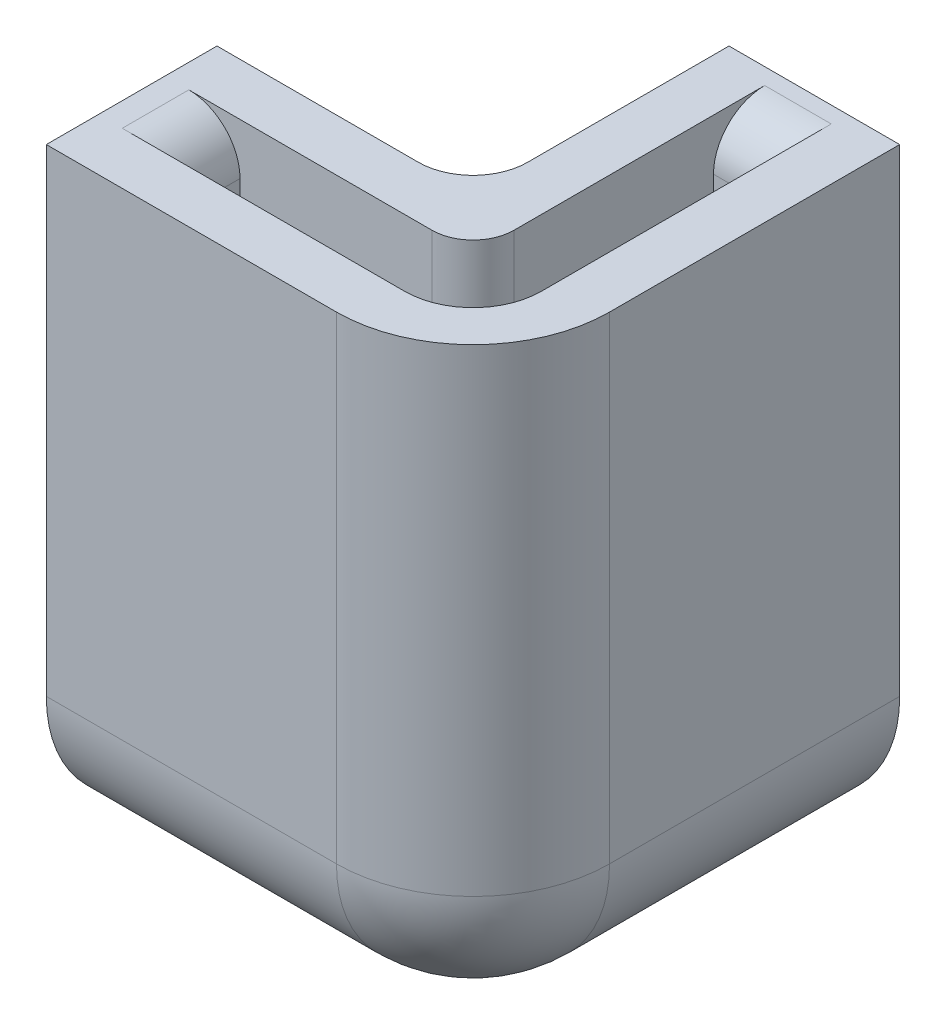
ISO-10303-21;
HEADER;
FILE_DESCRIPTION(('STEP AP214'),'2;1');
FILE_NAME('part.step','',(''),(''),'','','');
FILE_SCHEMA(('AUTOMOTIVE_DESIGN { 1 0 10303 214 1 1 1 1 }'));
ENDSEC;
DATA;
#1=APPLICATION_CONTEXT('core data for automotive mechanical design processes');
#2=APPLICATION_PROTOCOL_DEFINITION('international standard','automotive_design',2000,#1);
#3=PRODUCT_CONTEXT('',#1,'mechanical');
#4=PRODUCT('Part','Part','',(#3));
#5=PRODUCT_RELATED_PRODUCT_CATEGORY('part','',(#4));
#6=PRODUCT_DEFINITION_FORMATION('','',#4);
#7=PRODUCT_DEFINITION_CONTEXT('part definition',#1,'design');
#8=PRODUCT_DEFINITION('design','',#6,#7);
#9=PRODUCT_DEFINITION_SHAPE('','',#8);
#10=(LENGTH_UNIT() NAMED_UNIT(*) SI_UNIT(.MILLI.,.METRE.));
#11=(NAMED_UNIT(*) PLANE_ANGLE_UNIT() SI_UNIT($,.RADIAN.));
#12=(NAMED_UNIT(*) SI_UNIT($,.STERADIAN.) SOLID_ANGLE_UNIT());
#13=UNCERTAINTY_MEASURE_WITH_UNIT(LENGTH_MEASURE(1.E-05),#10,'distance_accuracy_value','');
#14=(GEOMETRIC_REPRESENTATION_CONTEXT(3) GLOBAL_UNCERTAINTY_ASSIGNED_CONTEXT((#13)) GLOBAL_UNIT_ASSIGNED_CONTEXT((#10,
#11,#12)) REPRESENTATION_CONTEXT('',''));
#15=CARTESIAN_POINT('',(0.,0.,0.));
#16=DIRECTION('',(0.,0.,1.));
#17=DIRECTION('',(1.,0.,0.));
#18=AXIS2_PLACEMENT_3D('',#15,#16,#17);
#19=CARTESIAN_POINT('',(7.5,18.,-12.5));
#20=DIRECTION('',(1.,0.,0.));
#21=DIRECTION('',(0.,0.,-1.));
#22=AXIS2_PLACEMENT_3D('',#19,#20,#21);
#23=PLANE('',#22);
#24=DIRECTION('',(0.,-1.,0.));
#25=VECTOR('',#24,1.);
#26=CARTESIAN_POINT('',(7.5,18.,-12.5));
#27=LINE('',#26,#25);
#28=CARTESIAN_POINT('',(7.5,18.,-12.5));
#29=VERTEX_POINT('',#28);
#30=CARTESIAN_POINT('',(7.5,6.6,-12.5));
#31=VERTEX_POINT('',#30);
#32=EDGE_CURVE('E372',#29,#31,#27,.T.);
#33=ORIENTED_EDGE('',*,*,#32,.T.);
#34=DIRECTION('',(0.,0.,1.));
#35=VECTOR('',#34,1.);
#36=CARTESIAN_POINT('',(7.5,6.6,-5.));
#37=LINE('',#36,#35);
#38=CARTESIAN_POINT('',(7.5,6.6,-6.6));
#39=VERTEX_POINT('',#38);
#40=EDGE_CURVE('E413',#31,#39,#37,.T.);
#41=ORIENTED_EDGE('',*,*,#40,.T.);
#42=DIRECTION('',(0.,-1.,0.));
#43=VECTOR('',#42,1.);
#44=CARTESIAN_POINT('',(7.5,18.,-6.6));
#45=LINE('',#44,#43);
#46=CARTESIAN_POINT('',(7.5,18.,-6.6));
#47=VERTEX_POINT('',#46);
#48=EDGE_CURVE('E410',#39,#47,#45,.F.);
#49=ORIENTED_EDGE('',*,*,#48,.T.);
#50=DIRECTION('',(0.,0.,1.));
#51=VECTOR('',#50,1.);
#52=CARTESIAN_POINT('',(7.5,18.,-12.5));
#53=LINE('',#52,#51);
#54=EDGE_CURVE('E357',#29,#47,#53,.T.);
#55=ORIENTED_EDGE('',*,*,#54,.F.);
#56=EDGE_LOOP('',(#33,#41,#49,#55));
#57=FACE_BOUND('',#56,.T.);
#58=ADVANCED_FACE('F49',(#57),#23,.F.);
#59=CARTESIAN_POINT('',(7.5,18.,-5.));
#60=DIRECTION('',(0.,0.,1.));
#61=DIRECTION('',(1.,0.,0.));
#62=AXIS2_PLACEMENT_3D('',#59,#60,#61);
#63=PLANE('',#62);
#64=DIRECTION('',(0.,-1.,0.));
#65=VECTOR('',#64,1.);
#66=CARTESIAN_POINT('',(5.9,5.,-5.));
#67=LINE('',#66,#65);
#68=CARTESIAN_POINT('',(5.9,18.,-5.));
#69=VERTEX_POINT('',#68);
#70=CARTESIAN_POINT('',(5.9,6.6,-5.));
#71=VERTEX_POINT('',#70);
#72=EDGE_CURVE('E397',#69,#71,#67,.T.);
#73=ORIENTED_EDGE('',*,*,#72,.T.);
#74=DIRECTION('',(-1.,0.,0.));
#75=VECTOR('',#74,1.);
#76=CARTESIAN_POINT('',(0.,6.6,-5.));
#77=LINE('',#76,#75);
#78=CARTESIAN_POINT('',(0.,6.6,-5.));
#79=VERTEX_POINT('',#78);
#80=EDGE_CURVE('E400',#71,#79,#77,.T.);
#81=ORIENTED_EDGE('',*,*,#80,.T.);
#82=DIRECTION('',(0.,-1.,0.));
#83=VECTOR('',#82,1.);
#84=CARTESIAN_POINT('',(0.,18.,-5.));
#85=LINE('',#84,#83);
#86=CARTESIAN_POINT('',(0.,18.,-5.));
#87=VERTEX_POINT('',#86);
#88=EDGE_CURVE('E364',#87,#79,#85,.T.);
#89=ORIENTED_EDGE('',*,*,#88,.F.);
#90=DIRECTION('',(-1.,0.,0.));
#91=VECTOR('',#90,1.);
#92=CARTESIAN_POINT('',(7.5,18.,-5.));
#93=LINE('',#92,#91);
#94=EDGE_CURVE('E361',#69,#87,#93,.T.);
#95=ORIENTED_EDGE('',*,*,#94,.F.);
#96=EDGE_LOOP('',(#73,#81,#89,#95));
#97=FACE_BOUND('',#96,.T.);
#98=ADVANCED_FACE('F530',(#97),#63,.F.);
#99=CARTESIAN_POINT('',(0.,18.,-5.));
#100=DIRECTION('',(1.,0.,0.));
#101=DIRECTION('',(0.,0.,-1.));
#102=AXIS2_PLACEMENT_3D('',#99,#100,#101);
#103=PLANE('',#102);
#104=DIRECTION('',(0.,0.,1.));
#105=VECTOR('',#104,1.);
#106=CARTESIAN_POINT('',(0.,0.,-5.));
#107=LINE('',#106,#105);
#108=CARTESIAN_POINT('',(0.,0.,-12.5));
#109=VERTEX_POINT('',#108);
#110=CARTESIAN_POINT('',(0.,0.,-4.));
#111=VERTEX_POINT('',#110);
#112=EDGE_CURVE('E343',#109,#111,#107,.T.);
#113=ORIENTED_EDGE('',*,*,#112,.T.);
#114=CARTESIAN_POINT('',(0.,4.,-4.));
#115=DIRECTION('',(1.,0.,0.));
#116=DIRECTION('',(0.,0.,-1.));
#117=AXIS2_PLACEMENT_3D('',#114,#115,#116);
#118=CIRCLE('',#117,4.);
#119=CARTESIAN_POINT('',(0.,4.,0.));
#120=VERTEX_POINT('',#119);
#121=EDGE_CURVE('E81',#111,#120,#118,.F.);
#122=ORIENTED_EDGE('',*,*,#121,.T.);
#123=DIRECTION('',(0.,-1.,0.));
#124=VECTOR('',#123,1.);
#125=CARTESIAN_POINT('',(0.,18.,0.));
#126=LINE('',#125,#124);
#127=CARTESIAN_POINT('',(0.,18.,0.));
#128=VERTEX_POINT('',#127);
#129=EDGE_CURVE('E379',#128,#120,#126,.T.);
#130=ORIENTED_EDGE('',*,*,#129,.F.);
#131=DIRECTION('',(0.,0.,1.));
#132=VECTOR('',#131,1.);
#133=CARTESIAN_POINT('',(0.,18.,-5.));
#134=LINE('',#133,#132);
#135=EDGE_CURVE('E344',#87,#128,#134,.T.);
#136=ORIENTED_EDGE('',*,*,#135,.F.);
#137=ORIENTED_EDGE('',*,*,#88,.T.);
#138=CARTESIAN_POINT('',(0.,6.6,-6.6));
#139=DIRECTION('',(1.,0.,0.));
#140=DIRECTION('',(0.,0.,-1.));
#141=AXIS2_PLACEMENT_3D('',#138,#139,#140);
#142=CIRCLE('',#141,1.6);
#143=CARTESIAN_POINT('',(0.,5.,-6.6));
#144=VERTEX_POINT('',#143);
#145=EDGE_CURVE('E450',#79,#144,#142,.T.);
#146=ORIENTED_EDGE('',*,*,#145,.T.);
#147=DIRECTION('',(0.,0.,-1.));
#148=VECTOR('',#147,1.);
#149=CARTESIAN_POINT('',(0.,5.,-5.));
#150=LINE('',#149,#148);
#151=CARTESIAN_POINT('',(0.,5.,-12.5));
#152=VERTEX_POINT('',#151);
#153=EDGE_CURVE('E313',#144,#152,#150,.T.);
#154=ORIENTED_EDGE('',*,*,#153,.T.);
#155=DIRECTION('',(0.,-1.,0.));
#156=VECTOR('',#155,1.);
#157=CARTESIAN_POINT('',(0.,5.,-12.5));
#158=LINE('',#157,#156);
#159=EDGE_CURVE('E339',#152,#109,#158,.T.);
#160=ORIENTED_EDGE('',*,*,#159,.T.);
#161=EDGE_LOOP('',(#113,#122,#130,#136,#137,#146,#154,#160));
#162=FACE_BOUND('',#161,.T.);
#163=ADVANCED_FACE('F506',(#162),#103,.F.);
#164=CARTESIAN_POINT('',(0.,18.,0.));
#165=DIRECTION('',(0.,0.,-1.));
#166=DIRECTION('',(-1.,0.,0.));
#167=AXIS2_PLACEMENT_3D('',#164,#165,#166);
#168=PLANE('',#167);
#169=ORIENTED_EDGE('',*,*,#129,.T.);
#170=DIRECTION('',(1.,0.,0.));
#171=VECTOR('',#170,1.);
#172=CARTESIAN_POINT('',(0.,4.,0.));
#173=LINE('',#172,#171);
#174=CARTESIAN_POINT('',(8.5,4.,0.));
#175=VERTEX_POINT('',#174);
#176=EDGE_CURVE('E70',#120,#175,#173,.T.);
#177=ORIENTED_EDGE('',*,*,#176,.T.);
#178=DIRECTION('',(0.,-1.,0.));
#179=VECTOR('',#178,1.);
#180=CARTESIAN_POINT('',(8.5,18.,0.));
#181=LINE('',#180,#179);
#182=CARTESIAN_POINT('',(8.5,18.,0.));
#183=VERTEX_POINT('',#182);
#184=EDGE_CURVE('E432',#175,#183,#181,.F.);
#185=ORIENTED_EDGE('',*,*,#184,.T.);
#186=DIRECTION('',(1.,0.,0.));
#187=VECTOR('',#186,1.);
#188=CARTESIAN_POINT('',(0.,18.,0.));
#189=LINE('',#188,#187);
#190=EDGE_CURVE('E347',#128,#183,#189,.T.);
#191=ORIENTED_EDGE('',*,*,#190,.F.);
#192=EDGE_LOOP('',(#169,#177,#185,#191));
#193=FACE_BOUND('',#192,.T.);
#194=ADVANCED_FACE('F502',(#193),#168,.F.);
#195=CARTESIAN_POINT('',(12.5,18.,0.));
#196=DIRECTION('',(-1.,0.,0.));
#197=DIRECTION('',(0.,0.,1.));
#198=AXIS2_PLACEMENT_3D('',#195,#196,#197);
#199=PLANE('',#198);
#200=DIRECTION('',(0.,-1.,0.));
#201=VECTOR('',#200,1.);
#202=CARTESIAN_POINT('',(12.5,18.,-4.));
#203=LINE('',#202,#201);
#204=CARTESIAN_POINT('',(12.5,18.,-4.));
#205=VERTEX_POINT('',#204);
#206=CARTESIAN_POINT('',(12.5,4.,-4.));
#207=VERTEX_POINT('',#206);
#208=EDGE_CURVE('E416',#205,#207,#203,.T.);
#209=ORIENTED_EDGE('',*,*,#208,.T.);
#210=DIRECTION('',(0.,0.,-1.));
#211=VECTOR('',#210,1.);
#212=CARTESIAN_POINT('',(12.5,4.,0.));
#213=LINE('',#212,#211);
#214=CARTESIAN_POINT('',(12.5,4.,-12.5));
#215=VERTEX_POINT('',#214);
#216=EDGE_CURVE('E419',#207,#215,#213,.T.);
#217=ORIENTED_EDGE('',*,*,#216,.T.);
#218=DIRECTION('',(0.,-1.,0.));
#219=VECTOR('',#218,1.);
#220=CARTESIAN_POINT('',(12.5,18.,-12.5));
#221=LINE('',#220,#219);
#222=CARTESIAN_POINT('',(12.5,18.,-12.5));
#223=VERTEX_POINT('',#222);
#224=EDGE_CURVE('E375',#223,#215,#221,.T.);
#225=ORIENTED_EDGE('',*,*,#224,.F.);
#226=DIRECTION('',(0.,0.,-1.));
#227=VECTOR('',#226,1.);
#228=CARTESIAN_POINT('',(12.5,18.,0.));
#229=LINE('',#228,#227);
#230=EDGE_CURVE('E351',#205,#223,#229,.T.);
#231=ORIENTED_EDGE('',*,*,#230,.F.);
#232=EDGE_LOOP('',(#209,#217,#225,#231));
#233=FACE_BOUND('',#232,.T.);
#234=ADVANCED_FACE('F487',(#233),#199,.F.);
#235=CARTESIAN_POINT('',(12.5,18.,-12.5));
#236=DIRECTION('',(0.,0.,1.));
#237=DIRECTION('',(1.,0.,0.));
#238=AXIS2_PLACEMENT_3D('',#235,#236,#237);
#239=PLANE('',#238);
#240=ORIENTED_EDGE('',*,*,#224,.T.);
#241=CARTESIAN_POINT('',(8.5,4.,-12.5));
#242=DIRECTION('',(0.,0.,1.));
#243=DIRECTION('',(1.,0.,0.));
#244=AXIS2_PLACEMENT_3D('',#241,#242,#243);
#245=CIRCLE('',#244,4.);
#246=CARTESIAN_POINT('',(8.5,0.,-12.5));
#247=VERTEX_POINT('',#246);
#248=EDGE_CURVE('E423',#215,#247,#245,.F.);
#249=ORIENTED_EDGE('',*,*,#248,.T.);
#250=DIRECTION('',(-1.,0.,0.));
#251=VECTOR('',#250,1.);
#252=CARTESIAN_POINT('',(12.5,0.,-12.5));
#253=LINE('',#252,#251);
#254=EDGE_CURVE('E348',#247,#109,#253,.T.);
#255=ORIENTED_EDGE('',*,*,#254,.T.);
#256=ORIENTED_EDGE('',*,*,#159,.F.);
#257=DIRECTION('',(1.,0.,0.));
#258=VECTOR('',#257,1.);
#259=CARTESIAN_POINT('',(0.,5.,-12.5));
#260=LINE('',#259,#258);
#261=CARTESIAN_POINT('',(5.9,5.,-12.5));
#262=VERTEX_POINT('',#261);
#263=EDGE_CURVE('E335',#152,#262,#260,.T.);
#264=ORIENTED_EDGE('',*,*,#263,.T.);
#265=CARTESIAN_POINT('',(5.9,6.6,-12.5));
#266=DIRECTION('',(0.,0.,1.));
#267=DIRECTION('',(1.,0.,0.));
#268=AXIS2_PLACEMENT_3D('',#265,#266,#267);
#269=CIRCLE('',#268,1.6);
#270=EDGE_CURVE('E59',#262,#31,#269,.T.);
#271=ORIENTED_EDGE('',*,*,#270,.T.);
#272=ORIENTED_EDGE('',*,*,#32,.F.);
#273=DIRECTION('',(-1.,0.,0.));
#274=VECTOR('',#273,1.);
#275=CARTESIAN_POINT('',(12.5,18.,-12.5));
#276=LINE('',#275,#274);
#277=EDGE_CURVE('E354',#223,#29,#276,.T.);
#278=ORIENTED_EDGE('',*,*,#277,.F.);
#279=EDGE_LOOP('',(#240,#249,#255,#256,#264,#271,#272,#278));
#280=FACE_BOUND('',#279,.T.);
#281=ADVANCED_FACE('F492',(#280),#239,.F.);
#282=CARTESIAN_POINT('',(0.,18.,0.));
#283=DIRECTION('',(0.,1.,0.));
#284=DIRECTION('',(0.,0.,1.));
#285=AXIS2_PLACEMENT_3D('',#282,#283,#284);
#286=PLANE('',#285);
#287=DIRECTION('',(0.,0.,1.));
#288=VECTOR('',#287,1.);
#289=CARTESIAN_POINT('',(9.025,18.,-10.52));
#290=LINE('',#289,#288);
#291=CARTESIAN_POINT('',(9.025,18.,-12.02));
#292=VERTEX_POINT('',#291);
#293=CARTESIAN_POINT('',(9.025,18.,-4.675));
#294=VERTEX_POINT('',#293);
#295=EDGE_CURVE('E293',#292,#294,#290,.T.);
#296=ORIENTED_EDGE('',*,*,#295,.F.);
#297=DIRECTION('',(-1.,0.,0.));
#298=VECTOR('',#297,1.);
#299=CARTESIAN_POINT('',(10.975,18.,-12.02));
#300=LINE('',#299,#298);
#301=CARTESIAN_POINT('',(10.975,18.,-12.02));
#302=VERTEX_POINT('',#301);
#303=EDGE_CURVE('E390',#292,#302,#300,.F.);
#304=ORIENTED_EDGE('',*,*,#303,.T.);
#305=DIRECTION('',(0.,0.,-1.));
#306=VECTOR('',#305,1.);
#307=CARTESIAN_POINT('',(10.975,18.,-10.52));
#308=LINE('',#307,#306);
#309=CARTESIAN_POINT('',(10.975,18.,-3.525));
#310=VERTEX_POINT('',#309);
#311=EDGE_CURVE('E267',#310,#302,#308,.T.);
#312=ORIENTED_EDGE('',*,*,#311,.F.);
#313=CARTESIAN_POINT('',(8.975,18.,-3.525));
#314=DIRECTION('',(0.,1.,0.));
#315=DIRECTION('',(0.,0.,-1.));
#316=AXIS2_PLACEMENT_3D('',#313,#314,#315);
#317=CIRCLE('',#316,2.);
#318=CARTESIAN_POINT('',(8.975,18.,-1.525));
#319=VERTEX_POINT('',#318);
#320=EDGE_CURVE('E271',#319,#310,#317,.T.);
#321=ORIENTED_EDGE('',*,*,#320,.F.);
#322=DIRECTION('',(1.,0.,0.));
#323=VECTOR('',#322,1.);
#324=CARTESIAN_POINT('',(8.975,18.,-1.525));
#325=LINE('',#324,#323);
#326=CARTESIAN_POINT('',(0.700000000000002,18.,-1.525));
#327=VERTEX_POINT('',#326);
#328=EDGE_CURVE('E304',#327,#319,#325,.T.);
#329=ORIENTED_EDGE('',*,*,#328,.F.);
#330=DIRECTION('',(0.,0.,1.));
#331=VECTOR('',#330,1.);
#332=CARTESIAN_POINT('',(0.700000000000002,18.,-3.475));
#333=LINE('',#332,#331);
#334=CARTESIAN_POINT('',(0.700000000000004,18.,-3.475));
#335=VERTEX_POINT('',#334);
#336=EDGE_CURVE('E387',#327,#335,#333,.F.);
#337=ORIENTED_EDGE('',*,*,#336,.T.);
#338=DIRECTION('',(-1.,0.,0.));
#339=VECTOR('',#338,1.);
#340=CARTESIAN_POINT('',(7.825,18.,-3.475));
#341=LINE('',#340,#339);
#342=CARTESIAN_POINT('',(7.825,18.,-3.475));
#343=VERTEX_POINT('',#342);
#344=EDGE_CURVE('E301',#343,#335,#341,.T.);
#345=ORIENTED_EDGE('',*,*,#344,.F.);
#346=CARTESIAN_POINT('',(7.825,18.,-4.675));
#347=DIRECTION('',(0.,-1.,0.));
#348=DIRECTION('',(0.,0.,-1.));
#349=AXIS2_PLACEMENT_3D('',#346,#347,#348);
#350=CIRCLE('',#349,1.2);
#351=EDGE_CURVE('E296',#294,#343,#350,.T.);
#352=ORIENTED_EDGE('',*,*,#351,.F.);
#353=EDGE_LOOP('',(#296,#304,#312,#321,#329,#337,#345,#352));
#354=FACE_BOUND('',#353,.T.);
#355=ORIENTED_EDGE('',*,*,#190,.T.);
#356=CARTESIAN_POINT('',(8.5,18.,-4.));
#357=DIRECTION('',(0.,1.,0.));
#358=DIRECTION('',(0.,0.,1.));
#359=AXIS2_PLACEMENT_3D('',#356,#357,#358);
#360=CIRCLE('',#359,4.);
#361=EDGE_CURVE('E384',#183,#205,#360,.T.);
#362=ORIENTED_EDGE('',*,*,#361,.T.);
#363=ORIENTED_EDGE('',*,*,#230,.T.);
#364=ORIENTED_EDGE('',*,*,#277,.T.);
#365=ORIENTED_EDGE('',*,*,#54,.T.);
#366=CARTESIAN_POINT('',(5.9,18.,-6.6));
#367=DIRECTION('',(0.,1.,0.));
#368=DIRECTION('',(0.,0.,1.));
#369=AXIS2_PLACEMENT_3D('',#366,#367,#368);
#370=CIRCLE('',#369,1.6);
#371=EDGE_CURVE('E12',#47,#69,#370,.F.);
#372=ORIENTED_EDGE('',*,*,#371,.T.);
#373=ORIENTED_EDGE('',*,*,#94,.T.);
#374=ORIENTED_EDGE('',*,*,#135,.T.);
#375=EDGE_LOOP('',(#355,#362,#363,#364,#365,#372,#373,#374));
#376=FACE_BOUND('',#375,.T.);
#377=ADVANCED_FACE('F497',(#354,#376),#286,.T.);
#378=CARTESIAN_POINT('',(0.,0.,0.));
#379=DIRECTION('',(0.,1.,0.));
#380=DIRECTION('',(0.,0.,1.));
#381=AXIS2_PLACEMENT_3D('',#378,#379,#380);
#382=PLANE('',#381);
#383=ORIENTED_EDGE('',*,*,#254,.F.);
#384=DIRECTION('',(0.,0.,-1.));
#385=VECTOR('',#384,1.);
#386=CARTESIAN_POINT('',(8.5,0.,0.));
#387=LINE('',#386,#385);
#388=CARTESIAN_POINT('',(8.5,0.,-4.));
#389=VERTEX_POINT('',#388);
#390=EDGE_CURVE('E429',#247,#389,#387,.F.);
#391=ORIENTED_EDGE('',*,*,#390,.T.);
#392=DIRECTION('',(1.,0.,0.));
#393=VECTOR('',#392,1.);
#394=CARTESIAN_POINT('',(0.,0.,-4.));
#395=LINE('',#394,#393);
#396=EDGE_CURVE('E426',#389,#111,#395,.F.);
#397=ORIENTED_EDGE('',*,*,#396,.T.);
#398=ORIENTED_EDGE('',*,*,#112,.F.);
#399=EDGE_LOOP('',(#383,#391,#397,#398));
#400=FACE_BOUND('',#399,.T.);
#401=ADVANCED_FACE('F509',(#400),#382,.F.);
#402=CARTESIAN_POINT('',(0.,5.,0.));
#403=DIRECTION('',(0.,-1.,0.));
#404=DIRECTION('',(0.,0.,-1.));
#405=AXIS2_PLACEMENT_3D('',#402,#403,#404);
#406=PLANE('',#405);
#407=ORIENTED_EDGE('',*,*,#153,.F.);
#408=DIRECTION('',(-1.,0.,0.));
#409=VECTOR('',#408,1.);
#410=CARTESIAN_POINT('',(7.5,5.,-6.6));
#411=LINE('',#410,#409);
#412=CARTESIAN_POINT('',(5.9,5.,-6.6));
#413=VERTEX_POINT('',#412);
#414=EDGE_CURVE('E407',#144,#413,#411,.F.);
#415=ORIENTED_EDGE('',*,*,#414,.T.);
#416=DIRECTION('',(0.,0.,1.));
#417=VECTOR('',#416,1.);
#418=CARTESIAN_POINT('',(5.9,5.,-12.5));
#419=LINE('',#418,#417);
#420=EDGE_CURVE('E404',#413,#262,#419,.F.);
#421=ORIENTED_EDGE('',*,*,#420,.T.);
#422=ORIENTED_EDGE('',*,*,#263,.F.);
#423=EDGE_LOOP('',(#407,#415,#421,#422));
#424=FACE_BOUND('',#423,.T.);
#425=ADVANCED_FACE('F515',(#424),#406,.F.);
#426=CARTESIAN_POINT('',(9.025,10.,-10.52));
#427=DIRECTION('',(0.,0.,-1.));
#428=DIRECTION('',(-1.,0.,0.));
#429=AXIS2_PLACEMENT_3D('',#426,#427,#428);
#430=PLANE('',#429);
#431=DIRECTION('',(0.,1.,0.));
#432=VECTOR('',#431,1.);
#433=CARTESIAN_POINT('',(10.975,10.,-10.52));
#434=LINE('',#433,#432);
#435=CARTESIAN_POINT('',(10.975,10.,-10.52));
#436=VERTEX_POINT('',#435);
#437=CARTESIAN_POINT('',(10.975,16.5,-10.52));
#438=VERTEX_POINT('',#437);
#439=EDGE_CURVE('E310',#436,#438,#434,.T.);
#440=ORIENTED_EDGE('',*,*,#439,.T.);
#441=DIRECTION('',(-1.,0.,0.));
#442=VECTOR('',#441,1.);
#443=CARTESIAN_POINT('',(9.025,16.5,-10.52));
#444=LINE('',#443,#442);
#445=CARTESIAN_POINT('',(9.025,16.5,-10.52));
#446=VERTEX_POINT('',#445);
#447=EDGE_CURVE('E246',#438,#446,#444,.T.);
#448=ORIENTED_EDGE('',*,*,#447,.T.);
#449=DIRECTION('',(0.,1.,0.));
#450=VECTOR('',#449,1.);
#451=CARTESIAN_POINT('',(9.025,10.,-10.52));
#452=LINE('',#451,#450);
#453=CARTESIAN_POINT('',(9.025,10.,-10.52));
#454=VERTEX_POINT('',#453);
#455=EDGE_CURVE('E238',#454,#446,#452,.T.);
#456=ORIENTED_EDGE('',*,*,#455,.F.);
#457=DIRECTION('',(-1.,0.,0.));
#458=VECTOR('',#457,1.);
#459=CARTESIAN_POINT('',(9.025,10.,-10.52));
#460=LINE('',#459,#458);
#461=EDGE_CURVE('E243',#436,#454,#460,.T.);
#462=ORIENTED_EDGE('',*,*,#461,.F.);
#463=EDGE_LOOP('',(#440,#448,#456,#462));
#464=FACE_BOUND('',#463,.T.);
#465=ADVANCED_FACE('F241',(#464),#430,.F.);
#466=CARTESIAN_POINT('',(10.975,10.,-10.52));
#467=DIRECTION('',(1.,0.,0.));
#468=DIRECTION('',(0.,0.,-1.));
#469=AXIS2_PLACEMENT_3D('',#466,#467,#468);
#470=PLANE('',#469);
#471=ORIENTED_EDGE('',*,*,#311,.T.);
#472=CARTESIAN_POINT('',(10.975,16.5,-12.02));
#473=DIRECTION('',(1.,0.,0.));
#474=DIRECTION('',(0.,0.,-1.));
#475=AXIS2_PLACEMENT_3D('',#472,#473,#474);
#476=CIRCLE('',#475,1.5);
#477=EDGE_CURVE('E442',#302,#438,#476,.T.);
#478=ORIENTED_EDGE('',*,*,#477,.T.);
#479=ORIENTED_EDGE('',*,*,#439,.F.);
#480=DIRECTION('',(0.,0.,-1.));
#481=VECTOR('',#480,1.);
#482=CARTESIAN_POINT('',(10.975,10.,-10.52));
#483=LINE('',#482,#481);
#484=CARTESIAN_POINT('',(10.975,10.,-3.525));
#485=VERTEX_POINT('',#484);
#486=EDGE_CURVE('E251',#485,#436,#483,.T.);
#487=ORIENTED_EDGE('',*,*,#486,.F.);
#488=DIRECTION('',(0.,1.,0.));
#489=VECTOR('',#488,1.);
#490=CARTESIAN_POINT('',(10.975,10.,-3.525));
#491=LINE('',#490,#489);
#492=EDGE_CURVE('E314',#485,#310,#491,.T.);
#493=ORIENTED_EDGE('',*,*,#492,.T.);
#494=EDGE_LOOP('',(#471,#478,#479,#487,#493));
#495=FACE_BOUND('',#494,.T.);
#496=ADVANCED_FACE('F628',(#495),#470,.F.);
#497=CARTESIAN_POINT('',(8.975,10.,-3.525));
#498=DIRECTION('',(0.,1.,0.));
#499=DIRECTION('',(0.,0.,1.));
#500=AXIS2_PLACEMENT_3D('',#497,#498,#499);
#501=CYLINDRICAL_SURFACE('',#500,2.);
#502=ORIENTED_EDGE('',*,*,#320,.T.);
#503=ORIENTED_EDGE('',*,*,#492,.F.);
#504=CARTESIAN_POINT('',(8.975,10.,-3.525));
#505=DIRECTION('',(0.,1.,0.));
#506=DIRECTION('',(0.,0.,-1.));
#507=AXIS2_PLACEMENT_3D('',#504,#505,#506);
#508=CIRCLE('',#507,2.);
#509=CARTESIAN_POINT('',(8.975,10.,-1.525));
#510=VERTEX_POINT('',#509);
#511=EDGE_CURVE('E288',#510,#485,#508,.T.);
#512=ORIENTED_EDGE('',*,*,#511,.F.);
#513=DIRECTION('',(0.,1.,0.));
#514=VECTOR('',#513,1.);
#515=CARTESIAN_POINT('',(8.975,10.,-1.525));
#516=LINE('',#515,#514);
#517=EDGE_CURVE('E317',#510,#319,#516,.T.);
#518=ORIENTED_EDGE('',*,*,#517,.T.);
#519=EDGE_LOOP('',(#502,#503,#512,#518));
#520=FACE_BOUND('',#519,.T.);
#521=ADVANCED_FACE('F637',(#520),#501,.F.);
#522=CARTESIAN_POINT('',(8.975,10.,-1.525));
#523=DIRECTION('',(0.,0.,1.));
#524=DIRECTION('',(1.,0.,0.));
#525=AXIS2_PLACEMENT_3D('',#522,#523,#524);
#526=PLANE('',#525);
#527=ORIENTED_EDGE('',*,*,#328,.T.);
#528=ORIENTED_EDGE('',*,*,#517,.F.);
#529=DIRECTION('',(1.,0.,0.));
#530=VECTOR('',#529,1.);
#531=CARTESIAN_POINT('',(8.975,10.,-1.525));
#532=LINE('',#531,#530);
#533=CARTESIAN_POINT('',(2.2,10.,-1.525));
#534=VERTEX_POINT('',#533);
#535=EDGE_CURVE('E284',#534,#510,#532,.T.);
#536=ORIENTED_EDGE('',*,*,#535,.F.);
#537=DIRECTION('',(0.,1.,0.));
#538=VECTOR('',#537,1.);
#539=CARTESIAN_POINT('',(2.2,10.,-1.525));
#540=LINE('',#539,#538);
#541=CARTESIAN_POINT('',(2.2,16.5,-1.525));
#542=VERTEX_POINT('',#541);
#543=EDGE_CURVE('E320',#534,#542,#540,.T.);
#544=ORIENTED_EDGE('',*,*,#543,.T.);
#545=CARTESIAN_POINT('',(0.700000000000002,16.5,-1.525));
#546=DIRECTION('',(0.,0.,1.));
#547=DIRECTION('',(1.,0.,0.));
#548=AXIS2_PLACEMENT_3D('',#545,#546,#547);
#549=CIRCLE('',#548,1.5);
#550=EDGE_CURVE('E445',#542,#327,#549,.T.);
#551=ORIENTED_EDGE('',*,*,#550,.T.);
#552=EDGE_LOOP('',(#527,#528,#536,#544,#551));
#553=FACE_BOUND('',#552,.T.);
#554=ADVANCED_FACE('F644',(#553),#526,.F.);
#555=CARTESIAN_POINT('',(2.2,10.,-3.475));
#556=DIRECTION('',(-1.,0.,0.));
#557=DIRECTION('',(0.,0.,1.));
#558=AXIS2_PLACEMENT_3D('',#555,#556,#557);
#559=PLANE('',#558);
#560=DIRECTION('',(0.,1.,0.));
#561=VECTOR('',#560,1.);
#562=CARTESIAN_POINT('',(2.2,10.,-3.475));
#563=LINE('',#562,#561);
#564=CARTESIAN_POINT('',(2.2,10.,-3.475));
#565=VERTEX_POINT('',#564);
#566=CARTESIAN_POINT('',(2.2,16.5,-3.475));
#567=VERTEX_POINT('',#566);
#568=EDGE_CURVE('E324',#565,#567,#563,.T.);
#569=ORIENTED_EDGE('',*,*,#568,.T.);
#570=DIRECTION('',(0.,0.,1.));
#571=VECTOR('',#570,1.);
#572=CARTESIAN_POINT('',(2.2,16.5,-1.525));
#573=LINE('',#572,#571);
#574=EDGE_CURVE('E394',#567,#542,#573,.T.);
#575=ORIENTED_EDGE('',*,*,#574,.T.);
#576=ORIENTED_EDGE('',*,*,#543,.F.);
#577=DIRECTION('',(0.,0.,1.));
#578=VECTOR('',#577,1.);
#579=CARTESIAN_POINT('',(2.2,10.,-3.475));
#580=LINE('',#579,#578);
#581=EDGE_CURVE('E280',#565,#534,#580,.T.);
#582=ORIENTED_EDGE('',*,*,#581,.F.);
#583=EDGE_LOOP('',(#569,#575,#576,#582));
#584=FACE_BOUND('',#583,.T.);
#585=ADVANCED_FACE('F648',(#584),#559,.F.);
#586=CARTESIAN_POINT('',(7.825,10.,-3.475));
#587=DIRECTION('',(0.,0.,-1.));
#588=DIRECTION('',(-1.,0.,0.));
#589=AXIS2_PLACEMENT_3D('',#586,#587,#588);
#590=PLANE('',#589);
#591=ORIENTED_EDGE('',*,*,#344,.T.);
#592=CARTESIAN_POINT('',(0.700000000000002,16.5,-3.475));
#593=DIRECTION('',(0.,0.,-1.));
#594=DIRECTION('',(-1.,0.,0.));
#595=AXIS2_PLACEMENT_3D('',#592,#593,#594);
#596=CIRCLE('',#595,1.5);
#597=EDGE_CURVE('E448',#335,#567,#596,.T.);
#598=ORIENTED_EDGE('',*,*,#597,.T.);
#599=ORIENTED_EDGE('',*,*,#568,.F.);
#600=DIRECTION('',(-1.,0.,0.));
#601=VECTOR('',#600,1.);
#602=CARTESIAN_POINT('',(7.825,10.,-3.475));
#603=LINE('',#602,#601);
#604=CARTESIAN_POINT('',(7.825,10.,-3.475));
#605=VERTEX_POINT('',#604);
#606=EDGE_CURVE('E276',#605,#565,#603,.T.);
#607=ORIENTED_EDGE('',*,*,#606,.F.);
#608=DIRECTION('',(0.,1.,0.));
#609=VECTOR('',#608,1.);
#610=CARTESIAN_POINT('',(7.825,10.,-3.475));
#611=LINE('',#610,#609);
#612=EDGE_CURVE('E328',#605,#343,#611,.T.);
#613=ORIENTED_EDGE('',*,*,#612,.T.);
#614=EDGE_LOOP('',(#591,#598,#599,#607,#613));
#615=FACE_BOUND('',#614,.T.);
#616=ADVANCED_FACE('F657',(#615),#590,.F.);
#617=CARTESIAN_POINT('',(7.825,10.,-4.675));
#618=DIRECTION('',(0.,1.,0.));
#619=DIRECTION('',(0.,0.,1.));
#620=AXIS2_PLACEMENT_3D('',#617,#618,#619);
#621=CYLINDRICAL_SURFACE('',#620,1.2);
#622=ORIENTED_EDGE('',*,*,#351,.T.);
#623=ORIENTED_EDGE('',*,*,#612,.F.);
#624=CARTESIAN_POINT('',(7.825,10.,-4.675));
#625=DIRECTION('',(0.,-1.,0.));
#626=DIRECTION('',(0.,0.,-1.));
#627=AXIS2_PLACEMENT_3D('',#624,#625,#626);
#628=CIRCLE('',#627,1.2);
#629=CARTESIAN_POINT('',(9.025,10.,-4.675));
#630=VERTEX_POINT('',#629);
#631=EDGE_CURVE('E261',#630,#605,#628,.T.);
#632=ORIENTED_EDGE('',*,*,#631,.F.);
#633=DIRECTION('',(0.,1.,0.));
#634=VECTOR('',#633,1.);
#635=CARTESIAN_POINT('',(9.025,10.,-4.675));
#636=LINE('',#635,#634);
#637=EDGE_CURVE('E250',#630,#294,#636,.T.);
#638=ORIENTED_EDGE('',*,*,#637,.T.);
#639=EDGE_LOOP('',(#622,#623,#632,#638));
#640=FACE_BOUND('',#639,.T.);
#641=ADVANCED_FACE('F666',(#640),#621,.T.);
#642=CARTESIAN_POINT('',(9.025,10.,-10.52));
#643=DIRECTION('',(-1.,0.,0.));
#644=DIRECTION('',(0.,0.,1.));
#645=AXIS2_PLACEMENT_3D('',#642,#643,#644);
#646=PLANE('',#645);
#647=ORIENTED_EDGE('',*,*,#295,.T.);
#648=ORIENTED_EDGE('',*,*,#637,.F.);
#649=DIRECTION('',(0.,0.,1.));
#650=VECTOR('',#649,1.);
#651=CARTESIAN_POINT('',(9.025,10.,-10.52));
#652=LINE('',#651,#650);
#653=EDGE_CURVE('E254',#454,#630,#652,.T.);
#654=ORIENTED_EDGE('',*,*,#653,.F.);
#655=ORIENTED_EDGE('',*,*,#455,.T.);
#656=CARTESIAN_POINT('',(9.025,16.5,-12.02));
#657=DIRECTION('',(-1.,0.,0.));
#658=DIRECTION('',(0.,0.,1.));
#659=AXIS2_PLACEMENT_3D('',#656,#657,#658);
#660=CIRCLE('',#659,1.5);
#661=EDGE_CURVE('E439',#446,#292,#660,.T.);
#662=ORIENTED_EDGE('',*,*,#661,.T.);
#663=EDGE_LOOP('',(#647,#648,#654,#655,#662));
#664=FACE_BOUND('',#663,.T.);
#665=ADVANCED_FACE('F256',(#664),#646,.F.);
#666=CARTESIAN_POINT('',(8.975,10.,-3.525));
#667=DIRECTION('',(0.,-1.,0.));
#668=DIRECTION('',(0.,0.,-1.));
#669=AXIS2_PLACEMENT_3D('',#666,#667,#668);
#670=PLANE('',#669);
#671=ORIENTED_EDGE('',*,*,#461,.T.);
#672=ORIENTED_EDGE('',*,*,#653,.T.);
#673=ORIENTED_EDGE('',*,*,#631,.T.);
#674=ORIENTED_EDGE('',*,*,#606,.T.);
#675=ORIENTED_EDGE('',*,*,#581,.T.);
#676=ORIENTED_EDGE('',*,*,#535,.T.);
#677=ORIENTED_EDGE('',*,*,#511,.T.);
#678=ORIENTED_EDGE('',*,*,#486,.T.);
#679=EDGE_LOOP('',(#671,#672,#673,#674,#675,#676,#677,#678));
#680=FACE_BOUND('',#679,.T.);
#681=ADVANCED_FACE('F263',(#680),#670,.F.);
#682=CARTESIAN_POINT('',(9.025,16.5,-12.02));
#683=DIRECTION('',(1.,0.,0.));
#684=DIRECTION('',(0.,0.,-1.));
#685=AXIS2_PLACEMENT_3D('',#682,#683,#684);
#686=CYLINDRICAL_SURFACE('',#685,1.5);
#687=ORIENTED_EDGE('',*,*,#477,.F.);
#688=ORIENTED_EDGE('',*,*,#303,.F.);
#689=ORIENTED_EDGE('',*,*,#661,.F.);
#690=ORIENTED_EDGE('',*,*,#447,.F.);
#691=EDGE_LOOP('',(#687,#688,#689,#690));
#692=FACE_BOUND('',#691,.T.);
#693=ADVANCED_FACE('F553',(#692),#686,.T.);
#694=CARTESIAN_POINT('',(0.700000000000002,16.5,-3.475));
#695=DIRECTION('',(0.,0.,-1.));
#696=DIRECTION('',(-1.,0.,0.));
#697=AXIS2_PLACEMENT_3D('',#694,#695,#696);
#698=CYLINDRICAL_SURFACE('',#697,1.5);
#699=ORIENTED_EDGE('',*,*,#597,.F.);
#700=ORIENTED_EDGE('',*,*,#336,.F.);
#701=ORIENTED_EDGE('',*,*,#550,.F.);
#702=ORIENTED_EDGE('',*,*,#574,.F.);
#703=EDGE_LOOP('',(#699,#700,#701,#702));
#704=FACE_BOUND('',#703,.T.);
#705=ADVANCED_FACE('F556',(#704),#698,.T.);
#706=CARTESIAN_POINT('',(5.9,6.6,-12.5));
#707=DIRECTION('',(0.,0.,-1.));
#708=DIRECTION('',(-1.,0.,0.));
#709=AXIS2_PLACEMENT_3D('',#706,#707,#708);
#710=CYLINDRICAL_SURFACE('',#709,1.6);
#711=ORIENTED_EDGE('',*,*,#270,.F.);
#712=ORIENTED_EDGE('',*,*,#420,.F.);
#713=CARTESIAN_POINT('',(5.9,6.6,-6.6));
#714=DIRECTION('',(0.,0.,-1.));
#715=DIRECTION('',(-1.,0.,0.));
#716=AXIS2_PLACEMENT_3D('',#713,#714,#715);
#717=CIRCLE('',#716,1.6);
#718=EDGE_CURVE('E297',#39,#413,#717,.T.);
#719=ORIENTED_EDGE('',*,*,#718,.F.);
#720=ORIENTED_EDGE('',*,*,#40,.F.);
#721=EDGE_LOOP('',(#711,#712,#719,#720));
#722=FACE_BOUND('',#721,.T.);
#723=ADVANCED_FACE('F520',(#722),#710,.F.);
#724=CARTESIAN_POINT('',(5.9,18.,-6.6));
#725=DIRECTION('',(0.,1.,0.));
#726=DIRECTION('',(0.,0.,1.));
#727=AXIS2_PLACEMENT_3D('',#724,#725,#726);
#728=CYLINDRICAL_SURFACE('',#727,1.6);
#729=ORIENTED_EDGE('',*,*,#371,.F.);
#730=ORIENTED_EDGE('',*,*,#48,.F.);
#731=CARTESIAN_POINT('',(5.9,6.6,-6.6));
#732=DIRECTION('',(0.,1.,0.));
#733=DIRECTION('',(0.,0.,1.));
#734=AXIS2_PLACEMENT_3D('',#731,#732,#733);
#735=CIRCLE('',#734,1.6);
#736=EDGE_CURVE('E459',#71,#39,#735,.T.);
#737=ORIENTED_EDGE('',*,*,#736,.F.);
#738=ORIENTED_EDGE('',*,*,#72,.F.);
#739=EDGE_LOOP('',(#729,#730,#737,#738));
#740=FACE_BOUND('',#739,.T.);
#741=ADVANCED_FACE('F534',(#740),#728,.F.);
#742=CARTESIAN_POINT('',(5.9,6.6,-6.6));
#743=DIRECTION('',(1.,0.,0.));
#744=DIRECTION('',(0.,0.,-1.));
#745=AXIS2_PLACEMENT_3D('',#742,#743,#744);
#746=SPHERICAL_SURFACE('',#745,1.6);
#747=ORIENTED_EDGE('',*,*,#736,.T.);
#748=ORIENTED_EDGE('',*,*,#718,.T.);
#749=CARTESIAN_POINT('',(5.9,6.6,-6.6));
#750=DIRECTION('',(-1.,0.,0.));
#751=DIRECTION('',(0.,0.,1.));
#752=AXIS2_PLACEMENT_3D('',#749,#750,#751);
#753=CIRCLE('',#752,1.6);
#754=EDGE_CURVE('E455',#71,#413,#753,.F.);
#755=ORIENTED_EDGE('',*,*,#754,.F.);
#756=EDGE_LOOP('',(#747,#748,#755));
#757=FACE_BOUND('',#756,.T.);
#758=ADVANCED_FACE('F524',(#757),#746,.F.);
#759=CARTESIAN_POINT('',(7.5,6.6,-6.6));
#760=DIRECTION('',(1.,0.,0.));
#761=DIRECTION('',(0.,0.,-1.));
#762=AXIS2_PLACEMENT_3D('',#759,#760,#761);
#763=CYLINDRICAL_SURFACE('',#762,1.6);
#764=ORIENTED_EDGE('',*,*,#754,.T.);
#765=ORIENTED_EDGE('',*,*,#414,.F.);
#766=ORIENTED_EDGE('',*,*,#145,.F.);
#767=ORIENTED_EDGE('',*,*,#80,.F.);
#768=EDGE_LOOP('',(#764,#765,#766,#767));
#769=FACE_BOUND('',#768,.T.);
#770=ADVANCED_FACE('F528',(#769),#763,.F.);
#771=CARTESIAN_POINT('',(0.,4.,-4.));
#772=DIRECTION('',(1.,0.,0.));
#773=DIRECTION('',(0.,0.,-1.));
#774=AXIS2_PLACEMENT_3D('',#771,#772,#773);
#775=CYLINDRICAL_SURFACE('',#774,4.);
#776=ORIENTED_EDGE('',*,*,#121,.F.);
#777=ORIENTED_EDGE('',*,*,#396,.F.);
#778=CARTESIAN_POINT('',(8.5,4.,-4.));
#779=DIRECTION('',(1.,0.,0.));
#780=DIRECTION('',(0.,0.,-1.));
#781=AXIS2_PLACEMENT_3D('',#778,#779,#780);
#782=CIRCLE('',#781,4.);
#783=EDGE_CURVE('E53',#175,#389,#782,.T.);
#784=ORIENTED_EDGE('',*,*,#783,.F.);
#785=ORIENTED_EDGE('',*,*,#176,.F.);
#786=EDGE_LOOP('',(#776,#777,#784,#785));
#787=FACE_BOUND('',#786,.T.);
#788=ADVANCED_FACE('F51',(#787),#775,.T.);
#789=CARTESIAN_POINT('',(8.5,18.,-4.));
#790=DIRECTION('',(0.,-1.,0.));
#791=DIRECTION('',(0.,0.,-1.));
#792=AXIS2_PLACEMENT_3D('',#789,#790,#791);
#793=CYLINDRICAL_SURFACE('',#792,4.);
#794=ORIENTED_EDGE('',*,*,#361,.F.);
#795=ORIENTED_EDGE('',*,*,#184,.F.);
#796=CARTESIAN_POINT('',(8.5,4.,-4.));
#797=DIRECTION('',(0.,-1.,0.));
#798=DIRECTION('',(0.,0.,-1.));
#799=AXIS2_PLACEMENT_3D('',#796,#797,#798);
#800=CIRCLE('',#799,4.);
#801=EDGE_CURVE('E469',#207,#175,#800,.T.);
#802=ORIENTED_EDGE('',*,*,#801,.F.);
#803=ORIENTED_EDGE('',*,*,#208,.F.);
#804=EDGE_LOOP('',(#794,#795,#802,#803));
#805=FACE_BOUND('',#804,.T.);
#806=ADVANCED_FACE('F501',(#805),#793,.T.);
#807=CARTESIAN_POINT('',(8.5,4.,-4.));
#808=DIRECTION('',(0.,0.,1.));
#809=DIRECTION('',(1.,0.,0.));
#810=AXIS2_PLACEMENT_3D('',#807,#808,#809);
#811=SPHERICAL_SURFACE('',#810,4.);
#812=ORIENTED_EDGE('',*,*,#801,.T.);
#813=ORIENTED_EDGE('',*,*,#783,.T.);
#814=CARTESIAN_POINT('',(8.5,4.,-4.));
#815=DIRECTION('',(0.,0.,1.));
#816=DIRECTION('',(1.,0.,0.));
#817=AXIS2_PLACEMENT_3D('',#814,#815,#816);
#818=CIRCLE('',#817,4.);
#819=EDGE_CURVE('E466',#207,#389,#818,.F.);
#820=ORIENTED_EDGE('',*,*,#819,.F.);
#821=EDGE_LOOP('',(#812,#813,#820));
#822=FACE_BOUND('',#821,.T.);
#823=ADVANCED_FACE('F478',(#822),#811,.T.);
#824=CARTESIAN_POINT('',(8.5,4.,0.));
#825=DIRECTION('',(0.,0.,-1.));
#826=DIRECTION('',(-1.,0.,0.));
#827=AXIS2_PLACEMENT_3D('',#824,#825,#826);
#828=CYLINDRICAL_SURFACE('',#827,4.);
#829=ORIENTED_EDGE('',*,*,#819,.T.);
#830=ORIENTED_EDGE('',*,*,#390,.F.);
#831=ORIENTED_EDGE('',*,*,#248,.F.);
#832=ORIENTED_EDGE('',*,*,#216,.F.);
#833=EDGE_LOOP('',(#829,#830,#831,#832));
#834=FACE_BOUND('',#833,.T.);
#835=ADVANCED_FACE('F484',(#834),#828,.T.);
#836=CLOSED_SHELL('',(#58,#98,#163,#194,#234,#281,#377,#401,#425,#465,#496,#521,#554,#585,#616,
#641,#665,#681,#693,#705,#723,#741,#758,#770,#788,#806,#823,#835));
#837=MANIFOLD_SOLID_BREP('B2',#836);
#838=ADVANCED_BREP_SHAPE_REPRESENTATION('',(#18,#837),#14);
#839=SHAPE_DEFINITION_REPRESENTATION(#9,#838);
ENDSEC;
END-ISO-10303-21;
